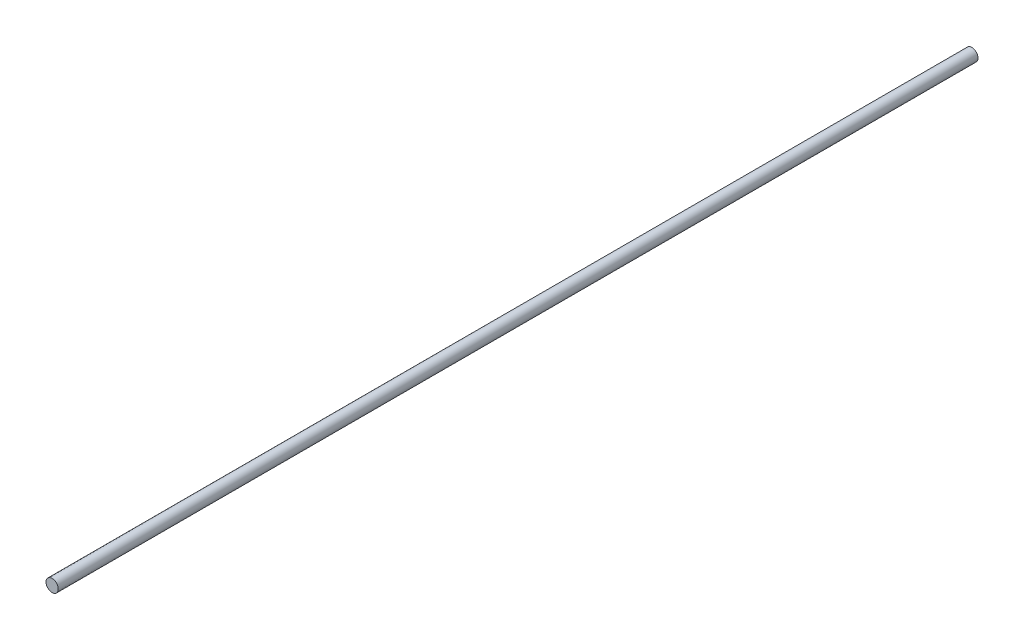
ISO-10303-21;
HEADER;
FILE_DESCRIPTION(('STEP AP214'),'2;1');
FILE_NAME('part.step','',(''),(''),'','','');
FILE_SCHEMA(('AUTOMOTIVE_DESIGN { 1 0 10303 214 1 1 1 1 }'));
ENDSEC;
DATA;
#1=APPLICATION_CONTEXT('core data for automotive mechanical design processes');
#2=APPLICATION_PROTOCOL_DEFINITION('international standard','automotive_design',2000,#1);
#3=PRODUCT_CONTEXT('',#1,'mechanical');
#4=PRODUCT('Part','Part','',(#3));
#5=PRODUCT_RELATED_PRODUCT_CATEGORY('part','',(#4));
#6=PRODUCT_DEFINITION_FORMATION('','',#4);
#7=PRODUCT_DEFINITION_CONTEXT('part definition',#1,'design');
#8=PRODUCT_DEFINITION('design','',#6,#7);
#9=PRODUCT_DEFINITION_SHAPE('','',#8);
#10=(LENGTH_UNIT() NAMED_UNIT(*) SI_UNIT(.MILLI.,.METRE.));
#11=(NAMED_UNIT(*) PLANE_ANGLE_UNIT() SI_UNIT($,.RADIAN.));
#12=(NAMED_UNIT(*) SI_UNIT($,.STERADIAN.) SOLID_ANGLE_UNIT());
#13=UNCERTAINTY_MEASURE_WITH_UNIT(LENGTH_MEASURE(1.E-05),#10,'distance_accuracy_value','');
#14=(GEOMETRIC_REPRESENTATION_CONTEXT(3) GLOBAL_UNCERTAINTY_ASSIGNED_CONTEXT((#13)) GLOBAL_UNIT_ASSIGNED_CONTEXT((#10,
#11,#12)) REPRESENTATION_CONTEXT('',''));
#15=CARTESIAN_POINT('',(0.,0.,0.));
#16=DIRECTION('',(0.,0.,1.));
#17=DIRECTION('',(1.,0.,0.));
#18=AXIS2_PLACEMENT_3D('',#15,#16,#17);
#19=CARTESIAN_POINT('',(0.,0.,300.));
#20=DIRECTION('',(0.,0.,-1.));
#21=DIRECTION('',(-1.,0.,0.));
#22=AXIS2_PLACEMENT_3D('',#19,#20,#21);
#23=CYLINDRICAL_SURFACE('',#22,4.);
#24=CARTESIAN_POINT('',(0.,0.,300.));
#25=DIRECTION('',(0.,0.,1.));
#26=DIRECTION('',(1.,0.,0.));
#27=AXIS2_PLACEMENT_3D('',#24,#25,#26);
#28=CIRCLE('',#27,4.);
#29=CARTESIAN_POINT('',(4.,0.,300.));
#30=VERTEX_POINT('',#29);
#31=EDGE_CURVE('E10',#30,#30,#28,.T.);
#32=ORIENTED_EDGE('',*,*,#31,.F.);
#33=EDGE_LOOP('',(#32));
#34=FACE_BOUND('',#33,.T.);
#35=CARTESIAN_POINT('',(0.,0.,-300.));
#36=DIRECTION('',(0.,0.,1.));
#37=DIRECTION('',(1.,0.,0.));
#38=AXIS2_PLACEMENT_3D('',#35,#36,#37);
#39=CIRCLE('',#38,4.);
#40=CARTESIAN_POINT('',(4.,0.,-300.));
#41=VERTEX_POINT('',#40);
#42=EDGE_CURVE('E46',#41,#41,#39,.T.);
#43=ORIENTED_EDGE('',*,*,#42,.T.);
#44=EDGE_LOOP('',(#43));
#45=FACE_BOUND('',#44,.T.);
#46=ADVANCED_FACE('F43',(#34,#45),#23,.T.);
#47=CARTESIAN_POINT('',(0.,0.,300.));
#48=DIRECTION('',(0.,0.,1.));
#49=DIRECTION('',(1.,0.,0.));
#50=AXIS2_PLACEMENT_3D('',#47,#48,#49);
#51=PLANE('',#50);
#52=ORIENTED_EDGE('',*,*,#31,.T.);
#53=EDGE_LOOP('',(#52));
#54=FACE_BOUND('',#53,.T.);
#55=ADVANCED_FACE('F58',(#54),#51,.T.);
#56=CARTESIAN_POINT('',(0.,0.,-300.));
#57=DIRECTION('',(0.,0.,1.));
#58=DIRECTION('',(1.,0.,0.));
#59=AXIS2_PLACEMENT_3D('',#56,#57,#58);
#60=PLANE('',#59);
#61=ORIENTED_EDGE('',*,*,#42,.F.);
#62=EDGE_LOOP('',(#61));
#63=FACE_BOUND('',#62,.T.);
#64=ADVANCED_FACE('F59',(#63),#60,.F.);
#65=CLOSED_SHELL('',(#46,#55,#64));
#66=MANIFOLD_SOLID_BREP('B2',#65);
#67=ADVANCED_BREP_SHAPE_REPRESENTATION('',(#18,#66),#14);
#68=SHAPE_DEFINITION_REPRESENTATION(#9,#67);
ENDSEC;
END-ISO-10303-21;
